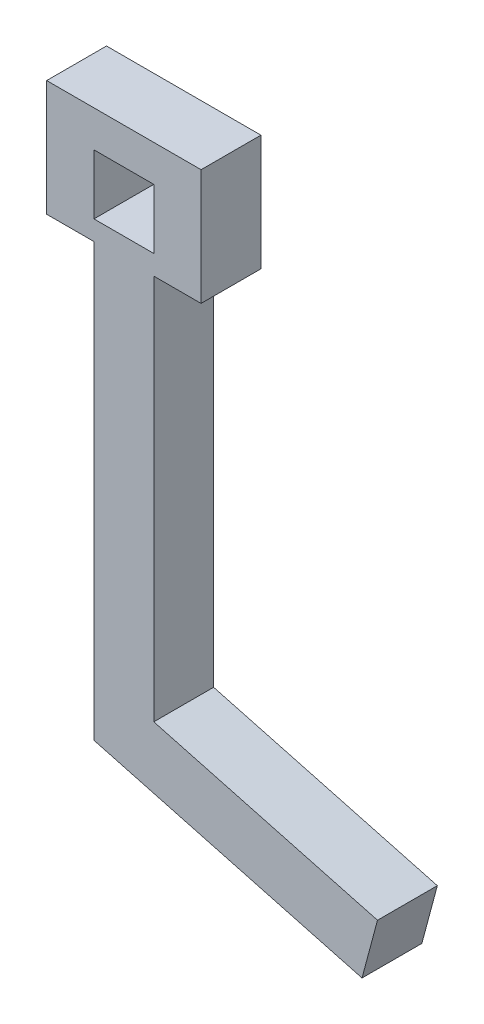
ISO-10303-21;
HEADER;
FILE_DESCRIPTION(('STEP AP214'),'2;1');
FILE_NAME('part.step','',(''),(''),'','','');
FILE_SCHEMA(('AUTOMOTIVE_DESIGN { 1 0 10303 214 1 1 1 1 }'));
ENDSEC;
DATA;
#1=APPLICATION_CONTEXT('core data for automotive mechanical design processes');
#2=APPLICATION_PROTOCOL_DEFINITION('international standard','automotive_design',2000,#1);
#3=PRODUCT_CONTEXT('',#1,'mechanical');
#4=PRODUCT('Part','Part','',(#3));
#5=PRODUCT_RELATED_PRODUCT_CATEGORY('part','',(#4));
#6=PRODUCT_DEFINITION_FORMATION('','',#4);
#7=PRODUCT_DEFINITION_CONTEXT('part definition',#1,'design');
#8=PRODUCT_DEFINITION('design','',#6,#7);
#9=PRODUCT_DEFINITION_SHAPE('','',#8);
#10=(LENGTH_UNIT() NAMED_UNIT(*) SI_UNIT(.MILLI.,.METRE.));
#11=(NAMED_UNIT(*) PLANE_ANGLE_UNIT() SI_UNIT($,.RADIAN.));
#12=(NAMED_UNIT(*) SI_UNIT($,.STERADIAN.) SOLID_ANGLE_UNIT());
#13=UNCERTAINTY_MEASURE_WITH_UNIT(LENGTH_MEASURE(1.E-05),#10,'distance_accuracy_value','');
#14=(GEOMETRIC_REPRESENTATION_CONTEXT(3) GLOBAL_UNCERTAINTY_ASSIGNED_CONTEXT((#13)) GLOBAL_UNIT_ASSIGNED_CONTEXT((#10,
#11,#12)) REPRESENTATION_CONTEXT('',''));
#15=CARTESIAN_POINT('',(0.,0.,0.));
#16=DIRECTION('',(0.,0.,1.));
#17=DIRECTION('',(1.,0.,0.));
#18=AXIS2_PLACEMENT_3D('',#15,#16,#17);
#19=CARTESIAN_POINT('',(0.,0.,15.5));
#20=DIRECTION('',(0.,0.,-1.));
#21=DIRECTION('',(-1.,0.,0.));
#22=AXIS2_PLACEMENT_3D('',#19,#20,#21);
#23=PLANE('',#22);
#24=DIRECTION('',(1.,0.,0.));
#25=VECTOR('',#24,1.);
#26=CARTESIAN_POINT('',(28.4666710872179,92.9762960423746,15.5));
#27=LINE('',#26,#25);
#28=CARTESIAN_POINT('',(16.2166710872179,92.9762960423746,15.5));
#29=VERTEX_POINT('',#28);
#30=CARTESIAN_POINT('',(28.4666710872179,92.9762960423746,15.5));
#31=VERTEX_POINT('',#30);
#32=EDGE_CURVE('E189',#29,#31,#27,.T.);
#33=ORIENTED_EDGE('',*,*,#32,.T.);
#34=DIRECTION('',(0.,-1.,0.));
#35=VECTOR('',#34,1.);
#36=CARTESIAN_POINT('',(28.4666710872179,-18.9172722712994,15.5));
#37=LINE('',#36,#35);
#38=CARTESIAN_POINT('',(28.4666710872179,-18.9172722712994,15.5));
#39=VERTEX_POINT('',#38);
#40=EDGE_CURVE('E193',#31,#39,#37,.T.);
#41=ORIENTED_EDGE('',*,*,#40,.T.);
#42=DIRECTION('',(0.965925826289069,-0.258819045102518,0.));
#43=VECTOR('',#42,1.);
#44=CARTESIAN_POINT('',(97.910525465473,-37.5246969712571,15.5));
#45=LINE('',#44,#43);
#46=CARTESIAN_POINT('',(97.910525465473,-37.5246969712571,15.5));
#47=VERTEX_POINT('',#46);
#48=EDGE_CURVE('E197',#39,#47,#45,.T.);
#49=ORIENTED_EDGE('',*,*,#48,.T.);
#50=DIRECTION('',(0.258819045102518,0.965925826289069,0.));
#51=VECTOR('',#50,1.);
#52=CARTESIAN_POINT('',(101.922220664562,-22.5528466637765,15.5));
#53=LINE('',#52,#51);
#54=CARTESIAN_POINT('',(101.922220664562,-22.5528466637765,15.5));
#55=VERTEX_POINT('',#54);
#56=EDGE_CURVE('E200',#47,#55,#53,.T.);
#57=ORIENTED_EDGE('',*,*,#56,.T.);
#58=DIRECTION('',(-0.965925826289069,0.258819045102518,0.));
#59=VECTOR('',#58,1.);
#60=CARTESIAN_POINT('',(43.9666710872179,-7.02370395762543,15.5));
#61=LINE('',#60,#59);
#62=CARTESIAN_POINT('',(43.9666710872179,-7.02370395762543,15.5));
#63=VERTEX_POINT('',#62);
#64=EDGE_CURVE('E203',#55,#63,#61,.T.);
#65=ORIENTED_EDGE('',*,*,#64,.T.);
#66=DIRECTION('',(0.,1.,0.));
#67=VECTOR('',#66,1.);
#68=CARTESIAN_POINT('',(43.9666710872178,92.9762960423746,15.5));
#69=LINE('',#68,#67);
#70=CARTESIAN_POINT('',(43.9666710872178,92.9762960423746,15.5));
#71=VERTEX_POINT('',#70);
#72=EDGE_CURVE('E206',#63,#71,#69,.T.);
#73=ORIENTED_EDGE('',*,*,#72,.T.);
#74=DIRECTION('',(1.,0.,0.));
#75=VECTOR('',#74,1.);
#76=CARTESIAN_POINT('',(56.2166710872179,92.9762960423746,15.5));
#77=LINE('',#76,#75);
#78=CARTESIAN_POINT('',(56.2166710872179,92.9762960423746,15.5));
#79=VERTEX_POINT('',#78);
#80=EDGE_CURVE('E209',#71,#79,#77,.T.);
#81=ORIENTED_EDGE('',*,*,#80,.T.);
#82=DIRECTION('',(0.,1.,0.));
#83=VECTOR('',#82,1.);
#84=CARTESIAN_POINT('',(56.2166710872179,122.976296042375,15.5));
#85=LINE('',#84,#83);
#86=CARTESIAN_POINT('',(56.2166710872179,122.976296042375,15.5));
#87=VERTEX_POINT('',#86);
#88=EDGE_CURVE('E212',#79,#87,#85,.T.);
#89=ORIENTED_EDGE('',*,*,#88,.T.);
#90=DIRECTION('',(-1.,0.,0.));
#91=VECTOR('',#90,1.);
#92=CARTESIAN_POINT('',(16.2166710872179,122.976296042375,15.5));
#93=LINE('',#92,#91);
#94=CARTESIAN_POINT('',(16.2166710872179,122.976296042375,15.5));
#95=VERTEX_POINT('',#94);
#96=EDGE_CURVE('E215',#87,#95,#93,.T.);
#97=ORIENTED_EDGE('',*,*,#96,.T.);
#98=DIRECTION('',(0.,-1.,0.));
#99=VECTOR('',#98,1.);
#100=CARTESIAN_POINT('',(16.2166710872179,92.9762960423746,15.5));
#101=LINE('',#100,#99);
#102=EDGE_CURVE('E218',#95,#29,#101,.T.);
#103=ORIENTED_EDGE('',*,*,#102,.T.);
#104=EDGE_LOOP('',(#33,#41,#49,#57,#65,#73,#81,#89,#97,#103));
#105=FACE_BOUND('',#104,.T.);
#106=DIRECTION('',(0.,1.,0.));
#107=VECTOR('',#106,1.);
#108=CARTESIAN_POINT('',(43.9666710872179,113.55833035079,15.5));
#109=LINE('',#108,#107);
#110=CARTESIAN_POINT('',(43.9666710872179,98.0583303507896,15.5));
#111=VERTEX_POINT('',#110);
#112=CARTESIAN_POINT('',(43.9666710872179,113.55833035079,15.5));
#113=VERTEX_POINT('',#112);
#114=EDGE_CURVE('E141',#111,#113,#109,.T.);
#115=ORIENTED_EDGE('',*,*,#114,.F.);
#116=DIRECTION('',(1.,0.,0.));
#117=VECTOR('',#116,1.);
#118=CARTESIAN_POINT('',(43.9666710872179,98.0583303507896,15.5));
#119=LINE('',#118,#117);
#120=CARTESIAN_POINT('',(28.4666710872179,98.0583303507896,15.5));
#121=VERTEX_POINT('',#120);
#122=EDGE_CURVE('E167',#121,#111,#119,.T.);
#123=ORIENTED_EDGE('',*,*,#122,.F.);
#124=DIRECTION('',(0.,-1.,0.));
#125=VECTOR('',#124,1.);
#126=CARTESIAN_POINT('',(28.4666710872179,98.0583303507896,15.5));
#127=LINE('',#126,#125);
#128=CARTESIAN_POINT('',(28.4666710872179,113.55833035079,15.5));
#129=VERTEX_POINT('',#128);
#130=EDGE_CURVE('E163',#129,#121,#127,.T.);
#131=ORIENTED_EDGE('',*,*,#130,.F.);
#132=DIRECTION('',(-1.,0.,0.));
#133=VECTOR('',#132,1.);
#134=CARTESIAN_POINT('',(28.4666710872179,113.55833035079,15.5));
#135=LINE('',#134,#133);
#136=EDGE_CURVE('E150',#113,#129,#135,.T.);
#137=ORIENTED_EDGE('',*,*,#136,.F.);
#138=EDGE_LOOP('',(#115,#123,#131,#137));
#139=FACE_BOUND('',#138,.T.);
#140=ADVANCED_FACE('F39',(#105,#139),#23,.F.);
#141=CARTESIAN_POINT('',(0.,0.,0.));
#142=DIRECTION('',(0.,0.,-1.));
#143=DIRECTION('',(-1.,0.,0.));
#144=AXIS2_PLACEMENT_3D('',#141,#142,#143);
#145=PLANE('',#144);
#146=DIRECTION('',(1.,0.,0.));
#147=VECTOR('',#146,1.);
#148=CARTESIAN_POINT('',(28.4666710872179,92.9762960423746,0.));
#149=LINE('',#148,#147);
#150=CARTESIAN_POINT('',(16.2166710872179,92.9762960423746,0.));
#151=VERTEX_POINT('',#150);
#152=CARTESIAN_POINT('',(28.4666710872179,92.9762960423746,0.));
#153=VERTEX_POINT('',#152);
#154=EDGE_CURVE('E159',#151,#153,#149,.T.);
#155=ORIENTED_EDGE('',*,*,#154,.F.);
#156=DIRECTION('',(0.,-1.,0.));
#157=VECTOR('',#156,1.);
#158=CARTESIAN_POINT('',(16.2166710872179,92.9762960423746,0.));
#159=LINE('',#158,#157);
#160=CARTESIAN_POINT('',(16.2166710872179,122.976296042375,0.));
#161=VERTEX_POINT('',#160);
#162=EDGE_CURVE('E194',#161,#151,#159,.T.);
#163=ORIENTED_EDGE('',*,*,#162,.F.);
#164=DIRECTION('',(-1.,0.,0.));
#165=VECTOR('',#164,1.);
#166=CARTESIAN_POINT('',(16.2166710872179,122.976296042375,0.));
#167=LINE('',#166,#165);
#168=CARTESIAN_POINT('',(56.2166710872179,122.976296042375,0.));
#169=VERTEX_POINT('',#168);
#170=EDGE_CURVE('E246',#169,#161,#167,.T.);
#171=ORIENTED_EDGE('',*,*,#170,.F.);
#172=DIRECTION('',(0.,1.,0.));
#173=VECTOR('',#172,1.);
#174=CARTESIAN_POINT('',(56.2166710872179,122.976296042375,0.));
#175=LINE('',#174,#173);
#176=CARTESIAN_POINT('',(56.2166710872179,92.9762960423746,0.));
#177=VERTEX_POINT('',#176);
#178=EDGE_CURVE('E243',#177,#169,#175,.T.);
#179=ORIENTED_EDGE('',*,*,#178,.F.);
#180=DIRECTION('',(1.,0.,0.));
#181=VECTOR('',#180,1.);
#182=CARTESIAN_POINT('',(56.2166710872179,92.9762960423746,0.));
#183=LINE('',#182,#181);
#184=CARTESIAN_POINT('',(43.9666710872178,92.9762960423746,0.));
#185=VERTEX_POINT('',#184);
#186=EDGE_CURVE('E240',#185,#177,#183,.T.);
#187=ORIENTED_EDGE('',*,*,#186,.F.);
#188=DIRECTION('',(0.,1.,0.));
#189=VECTOR('',#188,1.);
#190=CARTESIAN_POINT('',(43.9666710872178,92.9762960423746,0.));
#191=LINE('',#190,#189);
#192=CARTESIAN_POINT('',(43.9666710872179,-7.02370395762543,0.));
#193=VERTEX_POINT('',#192);
#194=EDGE_CURVE('E237',#193,#185,#191,.T.);
#195=ORIENTED_EDGE('',*,*,#194,.F.);
#196=DIRECTION('',(-0.965925826289069,0.258819045102518,0.));
#197=VECTOR('',#196,1.);
#198=CARTESIAN_POINT('',(43.9666710872179,-7.02370395762543,0.));
#199=LINE('',#198,#197);
#200=CARTESIAN_POINT('',(101.922220664562,-22.5528466637765,0.));
#201=VERTEX_POINT('',#200);
#202=EDGE_CURVE('E234',#201,#193,#199,.T.);
#203=ORIENTED_EDGE('',*,*,#202,.F.);
#204=DIRECTION('',(0.258819045102518,0.965925826289069,0.));
#205=VECTOR('',#204,1.);
#206=CARTESIAN_POINT('',(101.922220664562,-22.5528466637765,0.));
#207=LINE('',#206,#205);
#208=CARTESIAN_POINT('',(97.910525465473,-37.5246969712571,0.));
#209=VERTEX_POINT('',#208);
#210=EDGE_CURVE('E231',#209,#201,#207,.T.);
#211=ORIENTED_EDGE('',*,*,#210,.F.);
#212=DIRECTION('',(0.965925826289069,-0.258819045102518,0.));
#213=VECTOR('',#212,1.);
#214=CARTESIAN_POINT('',(97.910525465473,-37.5246969712571,0.));
#215=LINE('',#214,#213);
#216=CARTESIAN_POINT('',(28.4666710872179,-18.9172722712994,0.));
#217=VERTEX_POINT('',#216);
#218=EDGE_CURVE('E228',#217,#209,#215,.T.);
#219=ORIENTED_EDGE('',*,*,#218,.F.);
#220=DIRECTION('',(0.,-1.,0.));
#221=VECTOR('',#220,1.);
#222=CARTESIAN_POINT('',(28.4666710872179,-18.9172722712994,0.));
#223=LINE('',#222,#221);
#224=EDGE_CURVE('E225',#153,#217,#223,.T.);
#225=ORIENTED_EDGE('',*,*,#224,.F.);
#226=EDGE_LOOP('',(#155,#163,#171,#179,#187,#195,#203,#211,#219,#225));
#227=FACE_BOUND('',#226,.T.);
#228=DIRECTION('',(1.,0.,0.));
#229=VECTOR('',#228,1.);
#230=CARTESIAN_POINT('',(43.9666710872179,98.0583303507896,0.));
#231=LINE('',#230,#229);
#232=CARTESIAN_POINT('',(28.4666710872179,98.0583303507896,0.));
#233=VERTEX_POINT('',#232);
#234=CARTESIAN_POINT('',(43.9666710872179,98.0583303507896,0.));
#235=VERTEX_POINT('',#234);
#236=EDGE_CURVE('E151',#233,#235,#231,.T.);
#237=ORIENTED_EDGE('',*,*,#236,.T.);
#238=DIRECTION('',(0.,1.,0.));
#239=VECTOR('',#238,1.);
#240=CARTESIAN_POINT('',(43.9666710872179,113.55833035079,0.));
#241=LINE('',#240,#239);
#242=CARTESIAN_POINT('',(43.9666710872179,113.55833035079,0.));
#243=VERTEX_POINT('',#242);
#244=EDGE_CURVE('E63',#235,#243,#241,.T.);
#245=ORIENTED_EDGE('',*,*,#244,.T.);
#246=DIRECTION('',(-1.,0.,0.));
#247=VECTOR('',#246,1.);
#248=CARTESIAN_POINT('',(28.4666710872179,113.55833035079,0.));
#249=LINE('',#248,#247);
#250=CARTESIAN_POINT('',(28.4666710872179,113.55833035079,0.));
#251=VERTEX_POINT('',#250);
#252=EDGE_CURVE('E157',#243,#251,#249,.T.);
#253=ORIENTED_EDGE('',*,*,#252,.T.);
#254=DIRECTION('',(0.,-1.,0.));
#255=VECTOR('',#254,1.);
#256=CARTESIAN_POINT('',(28.4666710872179,98.0583303507896,0.));
#257=LINE('',#256,#255);
#258=EDGE_CURVE('E176',#251,#233,#257,.T.);
#259=ORIENTED_EDGE('',*,*,#258,.T.);
#260=EDGE_LOOP('',(#237,#245,#253,#259));
#261=FACE_BOUND('',#260,.T.);
#262=ADVANCED_FACE('F293',(#227,#261),#145,.T.);
#263=CARTESIAN_POINT('',(28.4666710872179,92.9762960423746,15.5));
#264=DIRECTION('',(0.,1.,0.));
#265=DIRECTION('',(0.,0.,1.));
#266=AXIS2_PLACEMENT_3D('',#263,#264,#265);
#267=PLANE('',#266);
#268=ORIENTED_EDGE('',*,*,#154,.T.);
#269=DIRECTION('',(0.,0.,-1.));
#270=VECTOR('',#269,1.);
#271=CARTESIAN_POINT('',(28.4666710872179,92.9762960423746,15.5));
#272=LINE('',#271,#270);
#273=EDGE_CURVE('E11',#31,#153,#272,.T.);
#274=ORIENTED_EDGE('',*,*,#273,.F.);
#275=ORIENTED_EDGE('',*,*,#32,.F.);
#276=DIRECTION('',(0.,0.,-1.));
#277=VECTOR('',#276,1.);
#278=CARTESIAN_POINT('',(16.2166710872179,92.9762960423746,15.5));
#279=LINE('',#278,#277);
#280=EDGE_CURVE('E221',#29,#151,#279,.T.);
#281=ORIENTED_EDGE('',*,*,#280,.T.);
#282=EDGE_LOOP('',(#268,#274,#275,#281));
#283=FACE_BOUND('',#282,.T.);
#284=ADVANCED_FACE('F41',(#283),#267,.F.);
#285=CARTESIAN_POINT('',(28.4666710872179,-18.9172722712994,15.5));
#286=DIRECTION('',(1.,0.,0.));
#287=DIRECTION('',(0.,1.,0.));
#288=AXIS2_PLACEMENT_3D('',#285,#286,#287);
#289=PLANE('',#288);
#290=ORIENTED_EDGE('',*,*,#224,.T.);
#291=DIRECTION('',(0.,0.,-1.));
#292=VECTOR('',#291,1.);
#293=CARTESIAN_POINT('',(28.4666710872179,-18.9172722712994,15.5));
#294=LINE('',#293,#292);
#295=EDGE_CURVE('E48',#39,#217,#294,.T.);
#296=ORIENTED_EDGE('',*,*,#295,.F.);
#297=ORIENTED_EDGE('',*,*,#40,.F.);
#298=ORIENTED_EDGE('',*,*,#273,.T.);
#299=EDGE_LOOP('',(#290,#296,#297,#298));
#300=FACE_BOUND('',#299,.T.);
#301=ADVANCED_FACE('F310',(#300),#289,.F.);
#302=CARTESIAN_POINT('',(97.910525465473,-37.5246969712571,15.5));
#303=DIRECTION('',(0.258819045102518,0.965925826289069,0.));
#304=DIRECTION('',(-0.965925826289069,0.258819045102518,0.));
#305=AXIS2_PLACEMENT_3D('',#302,#303,#304);
#306=PLANE('',#305);
#307=ORIENTED_EDGE('',*,*,#218,.T.);
#308=DIRECTION('',(0.,0.,-1.));
#309=VECTOR('',#308,1.);
#310=CARTESIAN_POINT('',(97.910525465473,-37.5246969712571,15.5));
#311=LINE('',#310,#309);
#312=EDGE_CURVE('E278',#47,#209,#311,.T.);
#313=ORIENTED_EDGE('',*,*,#312,.F.);
#314=ORIENTED_EDGE('',*,*,#48,.F.);
#315=ORIENTED_EDGE('',*,*,#295,.T.);
#316=EDGE_LOOP('',(#307,#313,#314,#315));
#317=FACE_BOUND('',#316,.T.);
#318=ADVANCED_FACE('F287',(#317),#306,.F.);
#319=CARTESIAN_POINT('',(101.922220664562,-22.5528466637765,15.5));
#320=DIRECTION('',(-0.965925826289069,0.258819045102518,0.));
#321=DIRECTION('',(-0.258819045102518,-0.965925826289069,0.));
#322=AXIS2_PLACEMENT_3D('',#319,#320,#321);
#323=PLANE('',#322);
#324=ORIENTED_EDGE('',*,*,#210,.T.);
#325=DIRECTION('',(0.,0.,-1.));
#326=VECTOR('',#325,1.);
#327=CARTESIAN_POINT('',(101.922220664562,-22.5528466637765,15.5));
#328=LINE('',#327,#326);
#329=EDGE_CURVE('E274',#55,#201,#328,.T.);
#330=ORIENTED_EDGE('',*,*,#329,.F.);
#331=ORIENTED_EDGE('',*,*,#56,.F.);
#332=ORIENTED_EDGE('',*,*,#312,.T.);
#333=EDGE_LOOP('',(#324,#330,#331,#332));
#334=FACE_BOUND('',#333,.T.);
#335=ADVANCED_FACE('F299',(#334),#323,.F.);
#336=CARTESIAN_POINT('',(43.9666710872179,-7.02370395762543,15.5));
#337=DIRECTION('',(-0.258819045102518,-0.965925826289069,0.));
#338=DIRECTION('',(0.965925826289069,-0.258819045102518,0.));
#339=AXIS2_PLACEMENT_3D('',#336,#337,#338);
#340=PLANE('',#339);
#341=ORIENTED_EDGE('',*,*,#202,.T.);
#342=DIRECTION('',(0.,0.,-1.));
#343=VECTOR('',#342,1.);
#344=CARTESIAN_POINT('',(43.9666710872179,-7.02370395762543,15.5));
#345=LINE('',#344,#343);
#346=EDGE_CURVE('E270',#63,#193,#345,.T.);
#347=ORIENTED_EDGE('',*,*,#346,.F.);
#348=ORIENTED_EDGE('',*,*,#64,.F.);
#349=ORIENTED_EDGE('',*,*,#329,.T.);
#350=EDGE_LOOP('',(#341,#347,#348,#349));
#351=FACE_BOUND('',#350,.T.);
#352=ADVANCED_FACE('F303',(#351),#340,.F.);
#353=CARTESIAN_POINT('',(43.9666710872178,92.9762960423746,15.5));
#354=DIRECTION('',(-1.,0.,0.));
#355=DIRECTION('',(0.,-1.,0.));
#356=AXIS2_PLACEMENT_3D('',#353,#354,#355);
#357=PLANE('',#356);
#358=ORIENTED_EDGE('',*,*,#194,.T.);
#359=DIRECTION('',(0.,0.,-1.));
#360=VECTOR('',#359,1.);
#361=CARTESIAN_POINT('',(43.9666710872178,92.9762960423746,15.5));
#362=LINE('',#361,#360);
#363=EDGE_CURVE('E266',#71,#185,#362,.T.);
#364=ORIENTED_EDGE('',*,*,#363,.F.);
#365=ORIENTED_EDGE('',*,*,#72,.F.);
#366=ORIENTED_EDGE('',*,*,#346,.T.);
#367=EDGE_LOOP('',(#358,#364,#365,#366));
#368=FACE_BOUND('',#367,.T.);
#369=ADVANCED_FACE('F333',(#368),#357,.F.);
#370=CARTESIAN_POINT('',(56.2166710872179,92.9762960423746,15.5));
#371=DIRECTION('',(0.,1.,0.));
#372=DIRECTION('',(0.,0.,1.));
#373=AXIS2_PLACEMENT_3D('',#370,#371,#372);
#374=PLANE('',#373);
#375=ORIENTED_EDGE('',*,*,#186,.T.);
#376=DIRECTION('',(0.,0.,-1.));
#377=VECTOR('',#376,1.);
#378=CARTESIAN_POINT('',(56.2166710872179,92.9762960423746,15.5));
#379=LINE('',#378,#377);
#380=EDGE_CURVE('E262',#79,#177,#379,.T.);
#381=ORIENTED_EDGE('',*,*,#380,.F.);
#382=ORIENTED_EDGE('',*,*,#80,.F.);
#383=ORIENTED_EDGE('',*,*,#363,.T.);
#384=EDGE_LOOP('',(#375,#381,#382,#383));
#385=FACE_BOUND('',#384,.T.);
#386=ADVANCED_FACE('F330',(#385),#374,.F.);
#387=CARTESIAN_POINT('',(56.2166710872179,122.976296042375,15.5));
#388=DIRECTION('',(-1.,0.,0.));
#389=DIRECTION('',(0.,-1.,0.));
#390=AXIS2_PLACEMENT_3D('',#387,#388,#389);
#391=PLANE('',#390);
#392=ORIENTED_EDGE('',*,*,#178,.T.);
#393=DIRECTION('',(0.,0.,-1.));
#394=VECTOR('',#393,1.);
#395=CARTESIAN_POINT('',(56.2166710872179,122.976296042375,15.5));
#396=LINE('',#395,#394);
#397=EDGE_CURVE('E258',#87,#169,#396,.T.);
#398=ORIENTED_EDGE('',*,*,#397,.F.);
#399=ORIENTED_EDGE('',*,*,#88,.F.);
#400=ORIENTED_EDGE('',*,*,#380,.T.);
#401=EDGE_LOOP('',(#392,#398,#399,#400));
#402=FACE_BOUND('',#401,.T.);
#403=ADVANCED_FACE('F326',(#402),#391,.F.);
#404=CARTESIAN_POINT('',(16.2166710872179,122.976296042375,15.5));
#405=DIRECTION('',(0.,-1.,0.));
#406=DIRECTION('',(1.,0.,0.));
#407=AXIS2_PLACEMENT_3D('',#404,#405,#406);
#408=PLANE('',#407);
#409=ORIENTED_EDGE('',*,*,#170,.T.);
#410=DIRECTION('',(0.,0.,-1.));
#411=VECTOR('',#410,1.);
#412=CARTESIAN_POINT('',(16.2166710872179,122.976296042375,15.5));
#413=LINE('',#412,#411);
#414=EDGE_CURVE('E254',#95,#161,#413,.T.);
#415=ORIENTED_EDGE('',*,*,#414,.F.);
#416=ORIENTED_EDGE('',*,*,#96,.F.);
#417=ORIENTED_EDGE('',*,*,#397,.T.);
#418=EDGE_LOOP('',(#409,#415,#416,#417));
#419=FACE_BOUND('',#418,.T.);
#420=ADVANCED_FACE('F322',(#419),#408,.F.);
#421=CARTESIAN_POINT('',(16.2166710872179,92.9762960423746,15.5));
#422=DIRECTION('',(1.,0.,0.));
#423=DIRECTION('',(0.,0.,-1.));
#424=AXIS2_PLACEMENT_3D('',#421,#422,#423);
#425=PLANE('',#424);
#426=ORIENTED_EDGE('',*,*,#162,.T.);
#427=ORIENTED_EDGE('',*,*,#280,.F.);
#428=ORIENTED_EDGE('',*,*,#102,.F.);
#429=ORIENTED_EDGE('',*,*,#414,.T.);
#430=EDGE_LOOP('',(#426,#427,#428,#429));
#431=FACE_BOUND('',#430,.T.);
#432=ADVANCED_FACE('F317',(#431),#425,.F.);
#433=CARTESIAN_POINT('',(43.9666710872179,113.55833035079,15.5));
#434=DIRECTION('',(-1.,0.,0.));
#435=DIRECTION('',(0.,-1.,0.));
#436=AXIS2_PLACEMENT_3D('',#433,#434,#435);
#437=PLANE('',#436);
#438=ORIENTED_EDGE('',*,*,#244,.F.);
#439=DIRECTION('',(0.,0.,-1.));
#440=VECTOR('',#439,1.);
#441=CARTESIAN_POINT('',(43.9666710872179,98.0583303507896,15.5));
#442=LINE('',#441,#440);
#443=EDGE_CURVE('E145',#111,#235,#442,.T.);
#444=ORIENTED_EDGE('',*,*,#443,.F.);
#445=ORIENTED_EDGE('',*,*,#114,.T.);
#446=DIRECTION('',(0.,0.,-1.));
#447=VECTOR('',#446,1.);
#448=CARTESIAN_POINT('',(43.9666710872179,113.55833035079,15.5));
#449=LINE('',#448,#447);
#450=EDGE_CURVE('E144',#113,#243,#449,.T.);
#451=ORIENTED_EDGE('',*,*,#450,.T.);
#452=EDGE_LOOP('',(#438,#444,#445,#451));
#453=FACE_BOUND('',#452,.T.);
#454=ADVANCED_FACE('F143',(#453),#437,.T.);
#455=CARTESIAN_POINT('',(28.4666710872179,113.55833035079,15.5));
#456=DIRECTION('',(0.,-1.,0.));
#457=DIRECTION('',(1.,0.,0.));
#458=AXIS2_PLACEMENT_3D('',#455,#456,#457);
#459=PLANE('',#458);
#460=ORIENTED_EDGE('',*,*,#252,.F.);
#461=ORIENTED_EDGE('',*,*,#450,.F.);
#462=ORIENTED_EDGE('',*,*,#136,.T.);
#463=DIRECTION('',(0.,0.,-1.));
#464=VECTOR('',#463,1.);
#465=CARTESIAN_POINT('',(28.4666710872179,113.55833035079,15.5));
#466=LINE('',#465,#464);
#467=EDGE_CURVE('E160',#129,#251,#466,.T.);
#468=ORIENTED_EDGE('',*,*,#467,.T.);
#469=EDGE_LOOP('',(#460,#461,#462,#468));
#470=FACE_BOUND('',#469,.T.);
#471=ADVANCED_FACE('F154',(#470),#459,.T.);
#472=CARTESIAN_POINT('',(28.4666710872179,98.0583303507896,15.5));
#473=DIRECTION('',(1.,0.,0.));
#474=DIRECTION('',(0.,0.,-1.));
#475=AXIS2_PLACEMENT_3D('',#472,#473,#474);
#476=PLANE('',#475);
#477=ORIENTED_EDGE('',*,*,#258,.F.);
#478=ORIENTED_EDGE('',*,*,#467,.F.);
#479=ORIENTED_EDGE('',*,*,#130,.T.);
#480=DIRECTION('',(0.,0.,-1.));
#481=VECTOR('',#480,1.);
#482=CARTESIAN_POINT('',(28.4666710872179,98.0583303507896,15.5));
#483=LINE('',#482,#481);
#484=EDGE_CURVE('E55',#121,#233,#483,.T.);
#485=ORIENTED_EDGE('',*,*,#484,.T.);
#486=EDGE_LOOP('',(#477,#478,#479,#485));
#487=FACE_BOUND('',#486,.T.);
#488=ADVANCED_FACE('F379',(#487),#476,.T.);
#489=CARTESIAN_POINT('',(43.9666710872179,98.0583303507896,15.5));
#490=DIRECTION('',(0.,1.,0.));
#491=DIRECTION('',(0.,0.,1.));
#492=AXIS2_PLACEMENT_3D('',#489,#490,#491);
#493=PLANE('',#492);
#494=ORIENTED_EDGE('',*,*,#236,.F.);
#495=ORIENTED_EDGE('',*,*,#484,.F.);
#496=ORIENTED_EDGE('',*,*,#122,.T.);
#497=ORIENTED_EDGE('',*,*,#443,.T.);
#498=EDGE_LOOP('',(#494,#495,#496,#497));
#499=FACE_BOUND('',#498,.T.);
#500=ADVANCED_FACE('F385',(#499),#493,.T.);
#501=CLOSED_SHELL('',(#140,#262,#284,#301,#318,#335,#352,#369,#386,#403,#420,#432,#454,#471,
#488,#500));
#502=MANIFOLD_SOLID_BREP('B2',#501);
#503=ADVANCED_BREP_SHAPE_REPRESENTATION('',(#18,#502),#14);
#504=SHAPE_DEFINITION_REPRESENTATION(#9,#503);
ENDSEC;
END-ISO-10303-21;
